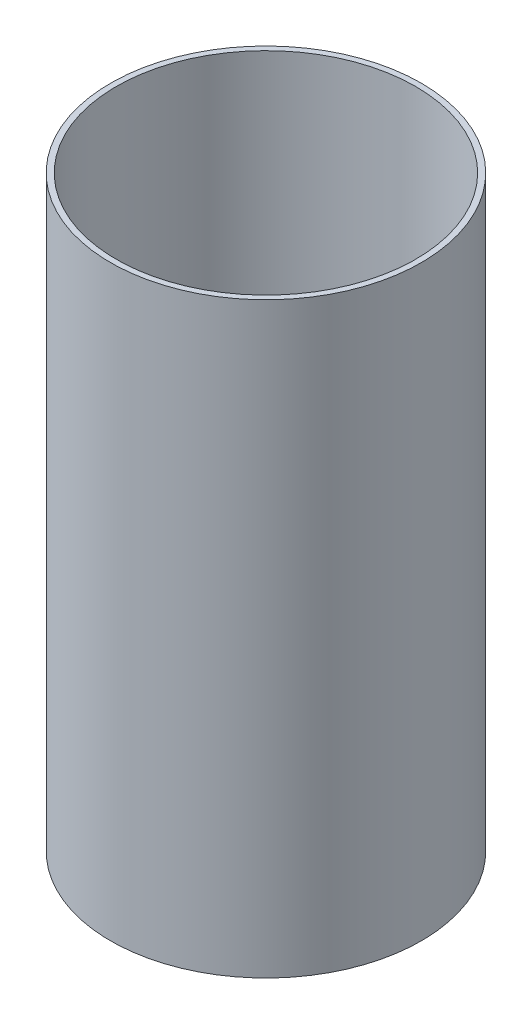
ISO-10303-21;
HEADER;
FILE_DESCRIPTION(('STEP AP214'),'2;1');
FILE_NAME('part.step','',(''),(''),'','','');
FILE_SCHEMA(('AUTOMOTIVE_DESIGN { 1 0 10303 214 1 1 1 1 }'));
ENDSEC;
DATA;
#1=APPLICATION_CONTEXT('core data for automotive mechanical design processes');
#2=APPLICATION_PROTOCOL_DEFINITION('international standard','automotive_design',2000,#1);
#3=PRODUCT_CONTEXT('',#1,'mechanical');
#4=PRODUCT('Part','Part','',(#3));
#5=PRODUCT_RELATED_PRODUCT_CATEGORY('part','',(#4));
#6=PRODUCT_DEFINITION_FORMATION('','',#4);
#7=PRODUCT_DEFINITION_CONTEXT('part definition',#1,'design');
#8=PRODUCT_DEFINITION('design','',#6,#7);
#9=PRODUCT_DEFINITION_SHAPE('','',#8);
#10=(LENGTH_UNIT() NAMED_UNIT(*) SI_UNIT(.MILLI.,.METRE.));
#11=(NAMED_UNIT(*) PLANE_ANGLE_UNIT() SI_UNIT($,.RADIAN.));
#12=(NAMED_UNIT(*) SI_UNIT($,.STERADIAN.) SOLID_ANGLE_UNIT());
#13=UNCERTAINTY_MEASURE_WITH_UNIT(LENGTH_MEASURE(1.E-05),#10,'distance_accuracy_value','');
#14=(GEOMETRIC_REPRESENTATION_CONTEXT(3) GLOBAL_UNCERTAINTY_ASSIGNED_CONTEXT((#13)) GLOBAL_UNIT_ASSIGNED_CONTEXT((#10,
#11,#12)) REPRESENTATION_CONTEXT('',''));
#15=CARTESIAN_POINT('',(0.,0.,0.));
#16=DIRECTION('',(0.,0.,1.));
#17=DIRECTION('',(1.,0.,0.));
#18=AXIS2_PLACEMENT_3D('',#15,#16,#17);
#19=CARTESIAN_POINT('',(0.,168.,0.));
#20=DIRECTION('',(0.,1.,0.));
#21=DIRECTION('',(0.,0.,1.));
#22=AXIS2_PLACEMENT_3D('',#19,#20,#21);
#23=PLANE('',#22);
#24=CARTESIAN_POINT('',(0.,168.,0.));
#25=DIRECTION('',(0.,1.,0.));
#26=DIRECTION('',(0.,0.,1.));
#27=AXIS2_PLACEMENT_3D('',#24,#25,#26);
#28=CIRCLE('',#27,44.45);
#29=CARTESIAN_POINT('',(0.,168.,-44.45));
#30=VERTEX_POINT('',#29);
#31=EDGE_CURVE('E10',#30,#30,#28,.T.);
#32=ORIENTED_EDGE('',*,*,#31,.T.);
#33=EDGE_LOOP('',(#32));
#34=FACE_BOUND('',#33,.T.);
#35=CARTESIAN_POINT('',(0.,168.,0.));
#36=DIRECTION('',(0.,1.,0.));
#37=DIRECTION('',(0.,0.,1.));
#38=AXIS2_PLACEMENT_3D('',#35,#36,#37);
#39=CIRCLE('',#38,42.82);
#40=CARTESIAN_POINT('',(0.,168.,-42.82));
#41=VERTEX_POINT('',#40);
#42=EDGE_CURVE('E54',#41,#41,#39,.T.);
#43=ORIENTED_EDGE('',*,*,#42,.F.);
#44=EDGE_LOOP('',(#43));
#45=FACE_BOUND('',#44,.T.);
#46=ADVANCED_FACE('F41',(#34,#45),#23,.T.);
#47=CARTESIAN_POINT('',(0.,0.,0.));
#48=DIRECTION('',(0.,1.,0.));
#49=DIRECTION('',(0.,0.,1.));
#50=AXIS2_PLACEMENT_3D('',#47,#48,#49);
#51=PLANE('',#50);
#52=CARTESIAN_POINT('',(0.,0.,0.));
#53=DIRECTION('',(0.,1.,0.));
#54=DIRECTION('',(0.,0.,1.));
#55=AXIS2_PLACEMENT_3D('',#52,#53,#54);
#56=CIRCLE('',#55,44.45);
#57=CARTESIAN_POINT('',(0.,0.,-44.45));
#58=VERTEX_POINT('',#57);
#59=EDGE_CURVE('E45',#58,#58,#56,.T.);
#60=ORIENTED_EDGE('',*,*,#59,.F.);
#61=EDGE_LOOP('',(#60));
#62=FACE_BOUND('',#61,.T.);
#63=CARTESIAN_POINT('',(0.,0.,0.));
#64=DIRECTION('',(0.,1.,0.));
#65=DIRECTION('',(0.,0.,1.));
#66=AXIS2_PLACEMENT_3D('',#63,#64,#65);
#67=CIRCLE('',#66,42.82);
#68=CARTESIAN_POINT('',(0.,0.,-42.82));
#69=VERTEX_POINT('',#68);
#70=EDGE_CURVE('E56',#69,#69,#67,.T.);
#71=ORIENTED_EDGE('',*,*,#70,.T.);
#72=EDGE_LOOP('',(#71));
#73=FACE_BOUND('',#72,.T.);
#74=ADVANCED_FACE('F68',(#62,#73),#51,.F.);
#75=CARTESIAN_POINT('',(0.,168.,0.));
#76=DIRECTION('',(0.,-1.,0.));
#77=DIRECTION('',(0.,0.,-1.));
#78=AXIS2_PLACEMENT_3D('',#75,#76,#77);
#79=CYLINDRICAL_SURFACE('',#78,44.45);
#80=CARTESIAN_POINT('',(0.,168.,-44.45));
#81=CARTESIAN_POINT('',(0.,166.25,-44.45));
#82=CARTESIAN_POINT('',(0.,164.5,-44.45));
#83=CARTESIAN_POINT('',(0.,161.,-44.45));
#84=CARTESIAN_POINT('',(0.,159.25,-44.45));
#85=CARTESIAN_POINT('',(0.,155.75,-44.45));
#86=CARTESIAN_POINT('',(0.,154.,-44.45));
#87=CARTESIAN_POINT('',(0.,150.5,-44.45));
#88=CARTESIAN_POINT('',(0.,148.75,-44.45));
#89=CARTESIAN_POINT('',(0.,145.25,-44.45));
#90=CARTESIAN_POINT('',(0.,143.5,-44.45));
#91=CARTESIAN_POINT('',(0.,140.,-44.45));
#92=CARTESIAN_POINT('',(0.,138.25,-44.45));
#93=CARTESIAN_POINT('',(0.,134.75,-44.45));
#94=CARTESIAN_POINT('',(0.,133.,-44.45));
#95=CARTESIAN_POINT('',(0.,129.5,-44.45));
#96=CARTESIAN_POINT('',(0.,127.75,-44.45));
#97=CARTESIAN_POINT('',(0.,124.25,-44.45));
#98=CARTESIAN_POINT('',(0.,122.5,-44.45));
#99=CARTESIAN_POINT('',(0.,119.,-44.45));
#100=CARTESIAN_POINT('',(0.,117.25,-44.45));
#101=CARTESIAN_POINT('',(0.,113.75,-44.45));
#102=CARTESIAN_POINT('',(0.,112.,-44.45));
#103=CARTESIAN_POINT('',(0.,108.5,-44.45));
#104=CARTESIAN_POINT('',(0.,106.75,-44.45));
#105=CARTESIAN_POINT('',(0.,103.25,-44.45));
#106=CARTESIAN_POINT('',(0.,101.5,-44.45));
#107=CARTESIAN_POINT('',(0.,98.,-44.45));
#108=CARTESIAN_POINT('',(0.,96.25,-44.45));
#109=CARTESIAN_POINT('',(0.,92.75,-44.45));
#110=CARTESIAN_POINT('',(0.,91.,-44.45));
#111=CARTESIAN_POINT('',(0.,87.5,-44.45));
#112=CARTESIAN_POINT('',(0.,85.75,-44.45));
#113=CARTESIAN_POINT('',(0.,82.25,-44.45));
#114=CARTESIAN_POINT('',(0.,80.5,-44.45));
#115=CARTESIAN_POINT('',(0.,77.,-44.45));
#116=CARTESIAN_POINT('',(0.,75.25,-44.45));
#117=CARTESIAN_POINT('',(0.,71.75,-44.45));
#118=CARTESIAN_POINT('',(0.,70.,-44.45));
#119=CARTESIAN_POINT('',(0.,66.5,-44.45));
#120=CARTESIAN_POINT('',(0.,64.75,-44.45));
#121=CARTESIAN_POINT('',(0.,61.25,-44.45));
#122=CARTESIAN_POINT('',(0.,59.5,-44.45));
#123=CARTESIAN_POINT('',(0.,56.,-44.45));
#124=CARTESIAN_POINT('',(0.,54.25,-44.45));
#125=CARTESIAN_POINT('',(0.,50.75,-44.45));
#126=CARTESIAN_POINT('',(0.,49.,-44.45));
#127=CARTESIAN_POINT('',(0.,45.5,-44.45));
#128=CARTESIAN_POINT('',(0.,43.75,-44.45));
#129=CARTESIAN_POINT('',(0.,40.25,-44.45));
#130=CARTESIAN_POINT('',(0.,38.5,-44.45));
#131=CARTESIAN_POINT('',(0.,35.,-44.45));
#132=CARTESIAN_POINT('',(0.,33.25,-44.45));
#133=CARTESIAN_POINT('',(0.,29.75,-44.45));
#134=CARTESIAN_POINT('',(0.,28.,-44.45));
#135=CARTESIAN_POINT('',(0.,24.5,-44.45));
#136=CARTESIAN_POINT('',(0.,22.75,-44.45));
#137=CARTESIAN_POINT('',(0.,19.25,-44.45));
#138=CARTESIAN_POINT('',(0.,17.5,-44.45));
#139=CARTESIAN_POINT('',(0.,14.,-44.45));
#140=CARTESIAN_POINT('',(0.,12.25,-44.45));
#141=CARTESIAN_POINT('',(0.,8.75000000000001,-44.45));
#142=CARTESIAN_POINT('',(0.,7.00000000000001,-44.45));
#143=CARTESIAN_POINT('',(0.,3.5,-44.45));
#144=CARTESIAN_POINT('',(0.,1.75,-44.45));
#145=CARTESIAN_POINT('',(0.,0.,-44.45));
#146=B_SPLINE_CURVE_WITH_KNOTS('',3,(#80,#81,#82,#83,#84,#85,#86,#87,#88,#89,#90,#91,#92,#93,
#94,#95,#96,#97,#98,#99,#100,#101,#102,#103,#104,#105,#106,#107,#108,#109,#110,#111,#112,#113,
#114,#115,#116,#117,#118,#119,#120,#121,#122,#123,#124,#125,#126,#127,#128,#129,#130,#131,#132,
#133,#134,#135,#136,#137,#138,#139,#140,#141,#142,#143,#144,#145),.UNSPECIFIED.,.F.,.F.,(4,2,2,
2,2,2,2,2,2,2,2,2,2,2,2,2,2,2,2,2,2,2,2,2,2,2,2,2,2,2,2,2,4),(0.,5.25,10.5,15.75,21.,26.25,31.5,
36.75,42.,47.25,52.5,57.75,63.,68.25,73.5,78.75,84.,89.25,94.5,99.75,105.,110.25,115.5,120.75,
126.,131.25,136.5,141.75,147.,152.25,157.5,162.75,168.),.UNSPECIFIED.);
#147=EDGE_CURVE('BSEAM43',#30,#58,#146,.T.);
#148=ORIENTED_EDGE('',*,*,#31,.F.);
#149=ORIENTED_EDGE('',*,*,#59,.T.);
#150=ORIENTED_EDGE('',*,*,#147,.T.);
#151=ORIENTED_EDGE('',*,*,#147,.F.);
#152=EDGE_LOOP('',(#148,#150,#149,#151));
#153=FACE_BOUND('',#152,.T.);
#154=ADVANCED_FACE('F43',(#153),#79,.T.);
#155=CARTESIAN_POINT('',(0.,168.,0.));
#156=DIRECTION('',(0.,-1.,0.));
#157=DIRECTION('',(0.,0.,-1.));
#158=AXIS2_PLACEMENT_3D('',#155,#156,#157);
#159=CYLINDRICAL_SURFACE('',#158,42.82);
#160=CARTESIAN_POINT('',(0.,168.,-42.82));
#161=CARTESIAN_POINT('',(0.,166.25,-42.82));
#162=CARTESIAN_POINT('',(0.,164.5,-42.82));
#163=CARTESIAN_POINT('',(0.,161.,-42.82));
#164=CARTESIAN_POINT('',(0.,159.25,-42.82));
#165=CARTESIAN_POINT('',(0.,155.75,-42.82));
#166=CARTESIAN_POINT('',(0.,154.,-42.82));
#167=CARTESIAN_POINT('',(0.,150.5,-42.82));
#168=CARTESIAN_POINT('',(0.,148.75,-42.82));
#169=CARTESIAN_POINT('',(0.,145.25,-42.82));
#170=CARTESIAN_POINT('',(0.,143.5,-42.82));
#171=CARTESIAN_POINT('',(0.,140.,-42.82));
#172=CARTESIAN_POINT('',(0.,138.25,-42.82));
#173=CARTESIAN_POINT('',(0.,134.75,-42.82));
#174=CARTESIAN_POINT('',(0.,133.,-42.82));
#175=CARTESIAN_POINT('',(0.,129.5,-42.82));
#176=CARTESIAN_POINT('',(0.,127.75,-42.82));
#177=CARTESIAN_POINT('',(0.,124.25,-42.82));
#178=CARTESIAN_POINT('',(0.,122.5,-42.82));
#179=CARTESIAN_POINT('',(0.,119.,-42.82));
#180=CARTESIAN_POINT('',(0.,117.25,-42.82));
#181=CARTESIAN_POINT('',(0.,113.75,-42.82));
#182=CARTESIAN_POINT('',(0.,112.,-42.82));
#183=CARTESIAN_POINT('',(0.,108.5,-42.82));
#184=CARTESIAN_POINT('',(0.,106.75,-42.82));
#185=CARTESIAN_POINT('',(0.,103.25,-42.82));
#186=CARTESIAN_POINT('',(0.,101.5,-42.82));
#187=CARTESIAN_POINT('',(0.,98.,-42.82));
#188=CARTESIAN_POINT('',(0.,96.25,-42.82));
#189=CARTESIAN_POINT('',(0.,92.75,-42.82));
#190=CARTESIAN_POINT('',(0.,91.,-42.82));
#191=CARTESIAN_POINT('',(0.,87.5,-42.82));
#192=CARTESIAN_POINT('',(0.,85.75,-42.82));
#193=CARTESIAN_POINT('',(0.,82.25,-42.82));
#194=CARTESIAN_POINT('',(0.,80.5,-42.82));
#195=CARTESIAN_POINT('',(0.,77.,-42.82));
#196=CARTESIAN_POINT('',(0.,75.25,-42.82));
#197=CARTESIAN_POINT('',(0.,71.75,-42.82));
#198=CARTESIAN_POINT('',(0.,70.,-42.82));
#199=CARTESIAN_POINT('',(0.,66.5,-42.82));
#200=CARTESIAN_POINT('',(0.,64.75,-42.82));
#201=CARTESIAN_POINT('',(0.,61.25,-42.82));
#202=CARTESIAN_POINT('',(0.,59.5,-42.82));
#203=CARTESIAN_POINT('',(0.,56.,-42.82));
#204=CARTESIAN_POINT('',(0.,54.25,-42.82));
#205=CARTESIAN_POINT('',(0.,50.75,-42.82));
#206=CARTESIAN_POINT('',(0.,49.,-42.82));
#207=CARTESIAN_POINT('',(0.,45.5,-42.82));
#208=CARTESIAN_POINT('',(0.,43.75,-42.82));
#209=CARTESIAN_POINT('',(0.,40.25,-42.82));
#210=CARTESIAN_POINT('',(0.,38.5,-42.82));
#211=CARTESIAN_POINT('',(0.,35.,-42.82));
#212=CARTESIAN_POINT('',(0.,33.25,-42.82));
#213=CARTESIAN_POINT('',(0.,29.75,-42.82));
#214=CARTESIAN_POINT('',(0.,28.,-42.82));
#215=CARTESIAN_POINT('',(0.,24.5,-42.82));
#216=CARTESIAN_POINT('',(0.,22.75,-42.82));
#217=CARTESIAN_POINT('',(0.,19.25,-42.82));
#218=CARTESIAN_POINT('',(0.,17.5,-42.82));
#219=CARTESIAN_POINT('',(0.,14.,-42.82));
#220=CARTESIAN_POINT('',(0.,12.25,-42.82));
#221=CARTESIAN_POINT('',(0.,8.75000000000001,-42.82));
#222=CARTESIAN_POINT('',(0.,7.00000000000001,-42.82));
#223=CARTESIAN_POINT('',(0.,3.5,-42.82));
#224=CARTESIAN_POINT('',(0.,1.75,-42.82));
#225=CARTESIAN_POINT('',(0.,0.,-42.82));
#226=B_SPLINE_CURVE_WITH_KNOTS('',3,(#160,#161,#162,#163,#164,#165,#166,#167,#168,#169,#170,
#171,#172,#173,#174,#175,#176,#177,#178,#179,#180,#181,#182,#183,#184,#185,#186,#187,#188,#189,
#190,#191,#192,#193,#194,#195,#196,#197,#198,#199,#200,#201,#202,#203,#204,#205,#206,#207,#208,
#209,#210,#211,#212,#213,#214,#215,#216,#217,#218,#219,#220,#221,#222,#223,#224,#225),
.UNSPECIFIED.,.F.,.F.,(4,2,2,2,2,2,2,2,2,2,2,2,2,2,2,2,2,2,2,2,2,2,2,2,2,2,2,2,2,2,2,2,4),(0.,
5.25,10.5,15.75,21.,26.25,31.5,36.75,42.,47.25,52.5,57.75,63.,68.25,73.5,78.75,84.,89.25,94.5,
99.75,105.,110.25,115.5,120.75,126.,131.25,136.5,141.75,147.,152.25,157.5,162.75,168.),.UNSPECIFIED.);
#227=EDGE_CURVE('BSEAM64',#41,#69,#226,.T.);
#228=ORIENTED_EDGE('',*,*,#42,.T.);
#229=ORIENTED_EDGE('',*,*,#70,.F.);
#230=ORIENTED_EDGE('',*,*,#227,.T.);
#231=ORIENTED_EDGE('',*,*,#227,.F.);
#232=EDGE_LOOP('',(#228,#230,#229,#231));
#233=FACE_BOUND('',#232,.T.);
#234=ADVANCED_FACE('F64',(#233),#159,.F.);
#235=CLOSED_SHELL('',(#46,#74,#154,#234));
#236=MANIFOLD_SOLID_BREP('B2',#235);
#237=ADVANCED_BREP_SHAPE_REPRESENTATION('',(#18,#236),#14);
#238=SHAPE_DEFINITION_REPRESENTATION(#9,#237);
ENDSEC;
END-ISO-10303-21;
